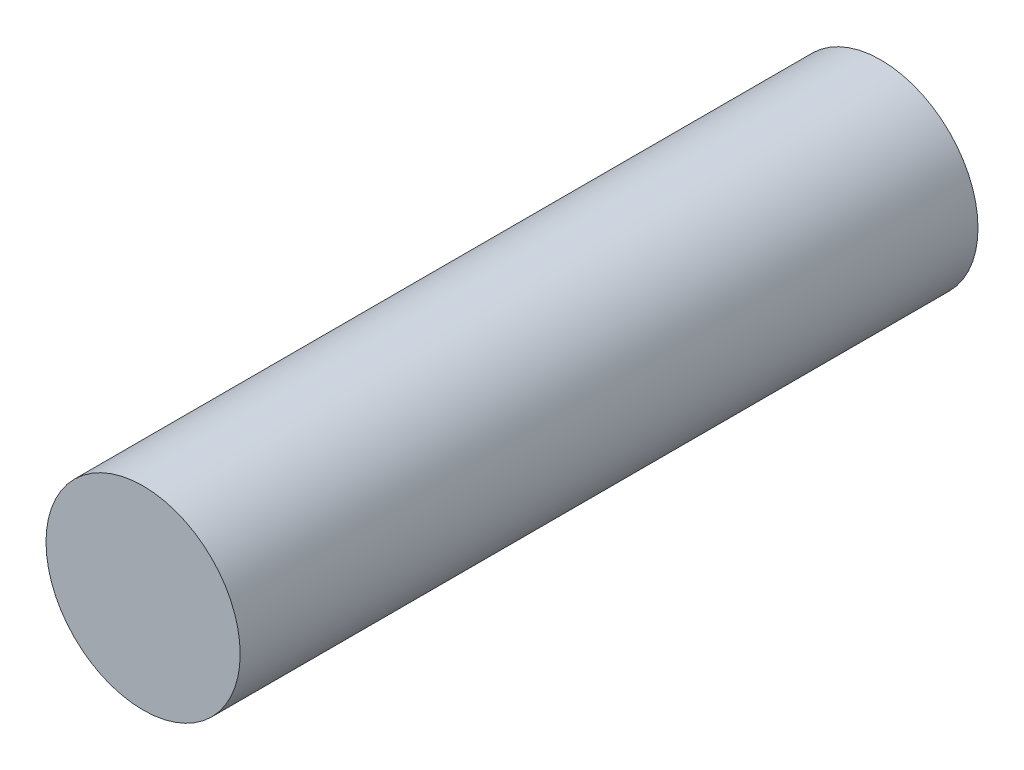
ISO-10303-21;
HEADER;
FILE_DESCRIPTION(('STEP AP214'),'2;1');
FILE_NAME('part.step','',(''),(''),'','','');
FILE_SCHEMA(('AUTOMOTIVE_DESIGN { 1 0 10303 214 1 1 1 1 }'));
ENDSEC;
DATA;
#1=APPLICATION_CONTEXT('core data for automotive mechanical design processes');
#2=APPLICATION_PROTOCOL_DEFINITION('international standard','automotive_design',2000,#1);
#3=PRODUCT_CONTEXT('',#1,'mechanical');
#4=PRODUCT('Part','Part','',(#3));
#5=PRODUCT_RELATED_PRODUCT_CATEGORY('part','',(#4));
#6=PRODUCT_DEFINITION_FORMATION('','',#4);
#7=PRODUCT_DEFINITION_CONTEXT('part definition',#1,'design');
#8=PRODUCT_DEFINITION('design','',#6,#7);
#9=PRODUCT_DEFINITION_SHAPE('','',#8);
#10=(LENGTH_UNIT() NAMED_UNIT(*) SI_UNIT(.MILLI.,.METRE.));
#11=(NAMED_UNIT(*) PLANE_ANGLE_UNIT() SI_UNIT($,.RADIAN.));
#12=(NAMED_UNIT(*) SI_UNIT($,.STERADIAN.) SOLID_ANGLE_UNIT());
#13=UNCERTAINTY_MEASURE_WITH_UNIT(LENGTH_MEASURE(1.E-05),#10,'distance_accuracy_value','');
#14=(GEOMETRIC_REPRESENTATION_CONTEXT(3) GLOBAL_UNCERTAINTY_ASSIGNED_CONTEXT((#13)) GLOBAL_UNIT_ASSIGNED_CONTEXT((#10,
#11,#12)) REPRESENTATION_CONTEXT('',''));
#15=CARTESIAN_POINT('',(0.,0.,0.));
#16=DIRECTION('',(0.,0.,1.));
#17=DIRECTION('',(1.,0.,0.));
#18=AXIS2_PLACEMENT_3D('',#15,#16,#17);
#19=CARTESIAN_POINT('',(0.,0.,12.065));
#20=DIRECTION('',(0.,0.,-1.));
#21=DIRECTION('',(-1.,0.,0.));
#22=AXIS2_PLACEMENT_3D('',#19,#20,#21);
#23=CYLINDRICAL_SURFACE('',#22,1.5875);
#24=CARTESIAN_POINT('',(0.,0.,12.065));
#25=DIRECTION('',(0.,0.,1.));
#26=DIRECTION('',(1.,0.,0.));
#27=AXIS2_PLACEMENT_3D('',#24,#25,#26);
#28=CIRCLE('',#27,1.5875);
#29=CARTESIAN_POINT('',(-1.5875,0.,12.065));
#30=VERTEX_POINT('',#29);
#31=EDGE_CURVE('E10',#30,#30,#28,.T.);
#32=CARTESIAN_POINT('',(0.,0.,0.));
#33=DIRECTION('',(0.,0.,1.));
#34=DIRECTION('',(1.,0.,0.));
#35=AXIS2_PLACEMENT_3D('',#32,#33,#34);
#36=CIRCLE('',#35,1.5875);
#37=CARTESIAN_POINT('',(-1.5875,0.,0.));
#38=VERTEX_POINT('',#37);
#39=EDGE_CURVE('E38',#38,#38,#36,.T.);
#40=CARTESIAN_POINT('',(-1.5875,0.,12.065));
#41=CARTESIAN_POINT('',(-1.5875,0.,11.9393229166667));
#42=CARTESIAN_POINT('',(-1.5875,0.,11.8136458333333));
#43=CARTESIAN_POINT('',(-1.5875,0.,11.5622916666667));
#44=CARTESIAN_POINT('',(-1.5875,0.,11.4366145833333));
#45=CARTESIAN_POINT('',(-1.5875,0.,11.1852604166667));
#46=CARTESIAN_POINT('',(-1.5875,0.,11.0595833333333));
#47=CARTESIAN_POINT('',(-1.5875,0.,10.8082291666667));
#48=CARTESIAN_POINT('',(-1.5875,0.,10.6825520833333));
#49=CARTESIAN_POINT('',(-1.5875,0.,10.4311979166667));
#50=CARTESIAN_POINT('',(-1.5875,0.,10.3055208333333));
#51=CARTESIAN_POINT('',(-1.5875,0.,10.0541666666667));
#52=CARTESIAN_POINT('',(-1.5875,0.,9.92848958333333));
#53=CARTESIAN_POINT('',(-1.5875,0.,9.67713541666667));
#54=CARTESIAN_POINT('',(-1.5875,0.,9.55145833333333));
#55=CARTESIAN_POINT('',(-1.5875,0.,9.30010416666667));
#56=CARTESIAN_POINT('',(-1.5875,0.,9.17442708333333));
#57=CARTESIAN_POINT('',(-1.5875,0.,8.92307291666667));
#58=CARTESIAN_POINT('',(-1.5875,0.,8.79739583333333));
#59=CARTESIAN_POINT('',(-1.5875,0.,8.54604166666667));
#60=CARTESIAN_POINT('',(-1.5875,0.,8.42036458333333));
#61=CARTESIAN_POINT('',(-1.5875,0.,8.16901041666667));
#62=CARTESIAN_POINT('',(-1.5875,0.,8.04333333333333));
#63=CARTESIAN_POINT('',(-1.5875,0.,7.79197916666666));
#64=CARTESIAN_POINT('',(-1.5875,0.,7.66630208333333));
#65=CARTESIAN_POINT('',(-1.5875,0.,7.41494791666666));
#66=CARTESIAN_POINT('',(-1.5875,0.,7.28927083333333));
#67=CARTESIAN_POINT('',(-1.5875,0.,7.03791666666667));
#68=CARTESIAN_POINT('',(-1.5875,0.,6.91223958333333));
#69=CARTESIAN_POINT('',(-1.5875,0.,6.66088541666667));
#70=CARTESIAN_POINT('',(-1.5875,0.,6.53520833333333));
#71=CARTESIAN_POINT('',(-1.5875,0.,6.28385416666667));
#72=CARTESIAN_POINT('',(-1.5875,0.,6.15817708333333));
#73=CARTESIAN_POINT('',(-1.5875,0.,5.90682291666667));
#74=CARTESIAN_POINT('',(-1.5875,0.,5.78114583333333));
#75=CARTESIAN_POINT('',(-1.5875,0.,5.52979166666667));
#76=CARTESIAN_POINT('',(-1.5875,0.,5.40411458333333));
#77=CARTESIAN_POINT('',(-1.5875,0.,5.15276041666666));
#78=CARTESIAN_POINT('',(-1.5875,0.,5.02708333333333));
#79=CARTESIAN_POINT('',(-1.5875,0.,4.77572916666667));
#80=CARTESIAN_POINT('',(-1.5875,0.,4.65005208333333));
#81=CARTESIAN_POINT('',(-1.5875,0.,4.39869791666667));
#82=CARTESIAN_POINT('',(-1.5875,0.,4.27302083333333));
#83=CARTESIAN_POINT('',(-1.5875,0.,4.02166666666667));
#84=CARTESIAN_POINT('',(-1.5875,0.,3.89598958333333));
#85=CARTESIAN_POINT('',(-1.5875,0.,3.64463541666667));
#86=CARTESIAN_POINT('',(-1.5875,0.,3.51895833333333));
#87=CARTESIAN_POINT('',(-1.5875,0.,3.26760416666666));
#88=CARTESIAN_POINT('',(-1.5875,0.,3.14192708333333));
#89=CARTESIAN_POINT('',(-1.5875,0.,2.89057291666666));
#90=CARTESIAN_POINT('',(-1.5875,0.,2.76489583333333));
#91=CARTESIAN_POINT('',(-1.5875,0.,2.51354166666667));
#92=CARTESIAN_POINT('',(-1.5875,0.,2.38786458333333));
#93=CARTESIAN_POINT('',(-1.5875,0.,2.13651041666667));
#94=CARTESIAN_POINT('',(-1.5875,0.,2.01083333333333));
#95=CARTESIAN_POINT('',(-1.5875,0.,1.75947916666667));
#96=CARTESIAN_POINT('',(-1.5875,0.,1.63380208333333));
#97=CARTESIAN_POINT('',(-1.5875,0.,1.38244791666667));
#98=CARTESIAN_POINT('',(-1.5875,0.,1.25677083333333));
#99=CARTESIAN_POINT('',(-1.5875,0.,1.00541666666666));
#100=CARTESIAN_POINT('',(-1.5875,0.,0.879739583333331));
#101=CARTESIAN_POINT('',(-1.5875,0.,0.628385416666665));
#102=CARTESIAN_POINT('',(-1.5875,0.,0.502708333333331));
#103=CARTESIAN_POINT('',(-1.5875,0.,0.251354166666665));
#104=CARTESIAN_POINT('',(-1.5875,0.,0.125677083333331));
#105=CARTESIAN_POINT('',(-1.5875,0.,0.));
#106=B_SPLINE_CURVE_WITH_KNOTS('',3,(#40,#41,#42,#43,#44,#45,#46,#47,#48,#49,#50,#51,#52,#53,
#54,#55,#56,#57,#58,#59,#60,#61,#62,#63,#64,#65,#66,#67,#68,#69,#70,#71,#72,#73,#74,#75,#76,#77,
#78,#79,#80,#81,#82,#83,#84,#85,#86,#87,#88,#89,#90,#91,#92,#93,#94,#95,#96,#97,#98,#99,#100,
#101,#102,#103,#104,#105),.UNSPECIFIED.,.F.,.F.,(4,2,2,2,2,2,2,2,2,2,2,2,2,2,2,2,2,2,2,2,2,2,2,
2,2,2,2,2,2,2,2,2,4),(0.,0.37703125,0.7540625,1.13109375,1.508125,1.88515625,2.2621875,
2.63921875,3.01625,3.39328125,3.7703125,4.14734375,4.524375,4.90140625,5.2784375,5.65546875,
6.0325,6.40953125,6.7865625,7.16359375,7.540625,7.91765625,8.2946875,8.67171875,9.04875,
9.42578125,9.8028125,10.17984375,10.556875,10.93390625,11.3109375,11.68796875,12.065),.UNSPECIFIED.);
#107=EDGE_CURVE('BSEAM35',#30,#38,#106,.T.);
#108=ORIENTED_EDGE('',*,*,#31,.F.);
#109=ORIENTED_EDGE('',*,*,#39,.T.);
#110=ORIENTED_EDGE('',*,*,#107,.T.);
#111=ORIENTED_EDGE('',*,*,#107,.F.);
#112=EDGE_LOOP('',(#108,#110,#109,#111));
#113=FACE_BOUND('',#112,.T.);
#114=ADVANCED_FACE('F35',(#113),#23,.T.);
#115=CARTESIAN_POINT('',(0.,0.,12.065));
#116=DIRECTION('',(0.,0.,1.));
#117=DIRECTION('',(1.,0.,0.));
#118=AXIS2_PLACEMENT_3D('',#115,#116,#117);
#119=PLANE('',#118);
#120=ORIENTED_EDGE('',*,*,#31,.T.);
#121=EDGE_LOOP('',(#120));
#122=FACE_BOUND('',#121,.T.);
#123=ADVANCED_FACE('F50',(#122),#119,.T.);
#124=CARTESIAN_POINT('',(0.,0.,0.));
#125=DIRECTION('',(0.,0.,1.));
#126=DIRECTION('',(1.,0.,0.));
#127=AXIS2_PLACEMENT_3D('',#124,#125,#126);
#128=PLANE('',#127);
#129=ORIENTED_EDGE('',*,*,#39,.F.);
#130=EDGE_LOOP('',(#129));
#131=FACE_BOUND('',#130,.T.);
#132=ADVANCED_FACE('F48',(#131),#128,.F.);
#133=CLOSED_SHELL('',(#114,#123,#132));
#134=MANIFOLD_SOLID_BREP('B2',#133);
#135=ADVANCED_BREP_SHAPE_REPRESENTATION('',(#18,#134),#14);
#136=SHAPE_DEFINITION_REPRESENTATION(#9,#135);
ENDSEC;
END-ISO-10303-21;
